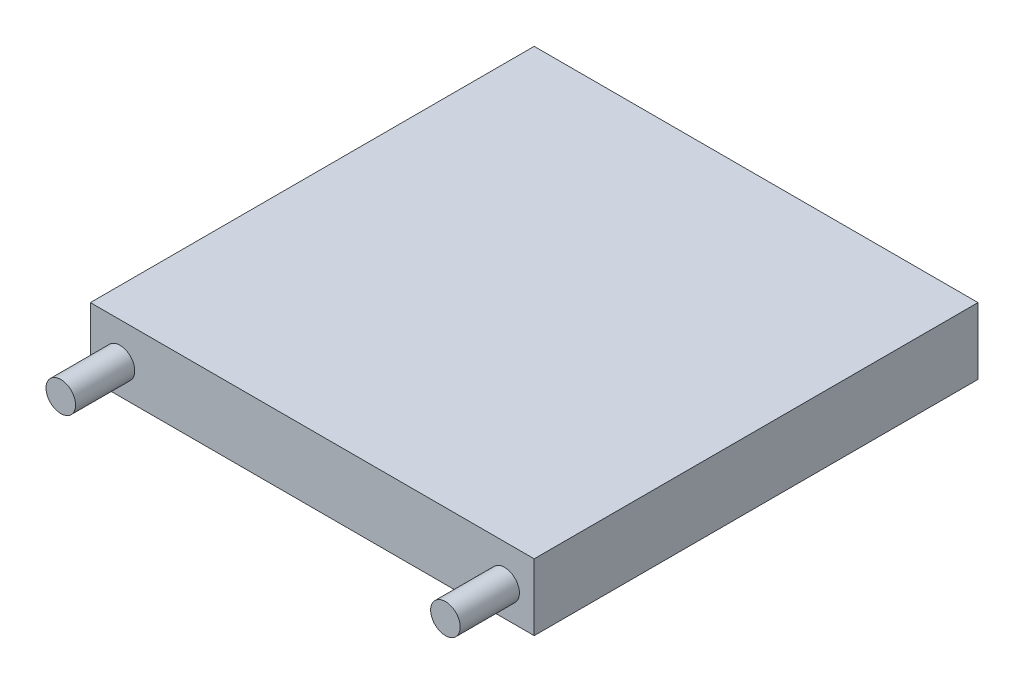
ISO-10303-21;
HEADER;
FILE_DESCRIPTION(('STEP AP214'),'2;1');
FILE_NAME('part.step','',(''),(''),'','','');
FILE_SCHEMA(('AUTOMOTIVE_DESIGN { 1 0 10303 214 1 1 1 1 }'));
ENDSEC;
DATA;
#1=APPLICATION_CONTEXT('core data for automotive mechanical design processes');
#2=APPLICATION_PROTOCOL_DEFINITION('international standard','automotive_design',2000,#1);
#3=PRODUCT_CONTEXT('',#1,'mechanical');
#4=PRODUCT('Part','Part','',(#3));
#5=PRODUCT_RELATED_PRODUCT_CATEGORY('part','',(#4));
#6=PRODUCT_DEFINITION_FORMATION('','',#4);
#7=PRODUCT_DEFINITION_CONTEXT('part definition',#1,'design');
#8=PRODUCT_DEFINITION('design','',#6,#7);
#9=PRODUCT_DEFINITION_SHAPE('','',#8);
#10=(LENGTH_UNIT() NAMED_UNIT(*) SI_UNIT(.MILLI.,.METRE.));
#11=(NAMED_UNIT(*) PLANE_ANGLE_UNIT() SI_UNIT($,.RADIAN.));
#12=(NAMED_UNIT(*) SI_UNIT($,.STERADIAN.) SOLID_ANGLE_UNIT());
#13=UNCERTAINTY_MEASURE_WITH_UNIT(LENGTH_MEASURE(1.E-05),#10,'distance_accuracy_value','');
#14=(GEOMETRIC_REPRESENTATION_CONTEXT(3) GLOBAL_UNCERTAINTY_ASSIGNED_CONTEXT((#13)) GLOBAL_UNIT_ASSIGNED_CONTEXT((#10,
#11,#12)) REPRESENTATION_CONTEXT('',''));
#15=CARTESIAN_POINT('',(0.,0.,0.));
#16=DIRECTION('',(0.,0.,1.));
#17=DIRECTION('',(1.,0.,0.));
#18=AXIS2_PLACEMENT_3D('',#15,#16,#17);
#19=CARTESIAN_POINT('',(15.,4.5,15.));
#20=DIRECTION('',(-1.,0.,0.));
#21=DIRECTION('',(0.,0.,1.));
#22=AXIS2_PLACEMENT_3D('',#19,#20,#21);
#23=PLANE('',#22);
#24=DIRECTION('',(0.,0.,-1.));
#25=VECTOR('',#24,1.);
#26=CARTESIAN_POINT('',(15.,0.,15.));
#27=LINE('',#26,#25);
#28=CARTESIAN_POINT('',(15.,0.,15.));
#29=VERTEX_POINT('',#28);
#30=CARTESIAN_POINT('',(15.,0.,-15.));
#31=VERTEX_POINT('',#30);
#32=EDGE_CURVE('E102',#29,#31,#27,.T.);
#33=ORIENTED_EDGE('',*,*,#32,.T.);
#34=DIRECTION('',(0.,-1.,0.));
#35=VECTOR('',#34,1.);
#36=CARTESIAN_POINT('',(15.,4.5,-15.));
#37=LINE('',#36,#35);
#38=CARTESIAN_POINT('',(15.,4.5,-15.));
#39=VERTEX_POINT('',#38);
#40=EDGE_CURVE('E93',#39,#31,#37,.T.);
#41=ORIENTED_EDGE('',*,*,#40,.F.);
#42=DIRECTION('',(0.,0.,-1.));
#43=VECTOR('',#42,1.);
#44=CARTESIAN_POINT('',(15.,4.5,15.));
#45=LINE('',#44,#43);
#46=CARTESIAN_POINT('',(15.,4.5,15.));
#47=VERTEX_POINT('',#46);
#48=EDGE_CURVE('E87',#47,#39,#45,.T.);
#49=ORIENTED_EDGE('',*,*,#48,.F.);
#50=DIRECTION('',(0.,-1.,0.));
#51=VECTOR('',#50,1.);
#52=CARTESIAN_POINT('',(15.,4.5,15.));
#53=LINE('',#52,#51);
#54=EDGE_CURVE('E98',#47,#29,#53,.T.);
#55=ORIENTED_EDGE('',*,*,#54,.T.);
#56=EDGE_LOOP('',(#33,#41,#49,#55));
#57=FACE_BOUND('',#56,.T.);
#58=ADVANCED_FACE('F35',(#57),#23,.F.);
#59=CARTESIAN_POINT('',(-15.,4.5,-15.));
#60=DIRECTION('',(0.,0.,1.));
#61=DIRECTION('',(1.,0.,0.));
#62=AXIS2_PLACEMENT_3D('',#59,#60,#61);
#63=PLANE('',#62);
#64=DIRECTION('',(-1.,0.,0.));
#65=VECTOR('',#64,1.);
#66=CARTESIAN_POINT('',(-15.,0.,-15.));
#67=LINE('',#66,#65);
#68=CARTESIAN_POINT('',(-15.,0.,-15.));
#69=VERTEX_POINT('',#68);
#70=EDGE_CURVE('E92',#31,#69,#67,.T.);
#71=ORIENTED_EDGE('',*,*,#70,.T.);
#72=DIRECTION('',(0.,-1.,0.));
#73=VECTOR('',#72,1.);
#74=CARTESIAN_POINT('',(-15.,4.5,-15.));
#75=LINE('',#74,#73);
#76=CARTESIAN_POINT('',(-15.,4.5,-15.));
#77=VERTEX_POINT('',#76);
#78=EDGE_CURVE('E90',#77,#69,#75,.T.);
#79=ORIENTED_EDGE('',*,*,#78,.F.);
#80=DIRECTION('',(-1.,0.,0.));
#81=VECTOR('',#80,1.);
#82=CARTESIAN_POINT('',(-15.,4.5,-15.));
#83=LINE('',#82,#81);
#84=EDGE_CURVE('E82',#39,#77,#83,.T.);
#85=ORIENTED_EDGE('',*,*,#84,.F.);
#86=ORIENTED_EDGE('',*,*,#40,.T.);
#87=EDGE_LOOP('',(#71,#79,#85,#86));
#88=FACE_BOUND('',#87,.T.);
#89=ADVANCED_FACE('F91',(#88),#63,.F.);
#90=CARTESIAN_POINT('',(-15.,4.5,15.));
#91=DIRECTION('',(1.,0.,0.));
#92=DIRECTION('',(0.,0.,-1.));
#93=AXIS2_PLACEMENT_3D('',#90,#91,#92);
#94=PLANE('',#93);
#95=DIRECTION('',(0.,0.,1.));
#96=VECTOR('',#95,1.);
#97=CARTESIAN_POINT('',(-15.,0.,15.));
#98=LINE('',#97,#96);
#99=CARTESIAN_POINT('',(-15.,0.,15.));
#100=VERTEX_POINT('',#99);
#101=EDGE_CURVE('E68',#69,#100,#98,.T.);
#102=ORIENTED_EDGE('',*,*,#101,.T.);
#103=DIRECTION('',(0.,-1.,0.));
#104=VECTOR('',#103,1.);
#105=CARTESIAN_POINT('',(-15.,4.5,15.));
#106=LINE('',#105,#104);
#107=CARTESIAN_POINT('',(-15.,4.5,15.));
#108=VERTEX_POINT('',#107);
#109=EDGE_CURVE('E94',#108,#100,#106,.T.);
#110=ORIENTED_EDGE('',*,*,#109,.F.);
#111=DIRECTION('',(0.,0.,1.));
#112=VECTOR('',#111,1.);
#113=CARTESIAN_POINT('',(-15.,4.5,15.));
#114=LINE('',#113,#112);
#115=EDGE_CURVE('E85',#77,#108,#114,.T.);
#116=ORIENTED_EDGE('',*,*,#115,.F.);
#117=ORIENTED_EDGE('',*,*,#78,.T.);
#118=EDGE_LOOP('',(#102,#110,#116,#117));
#119=FACE_BOUND('',#118,.T.);
#120=ADVANCED_FACE('F96',(#119),#94,.F.);
#121=CARTESIAN_POINT('',(-15.,4.5,15.));
#122=DIRECTION('',(0.,0.,-1.));
#123=DIRECTION('',(-1.,0.,0.));
#124=AXIS2_PLACEMENT_3D('',#121,#122,#123);
#125=PLANE('',#124);
#126=CARTESIAN_POINT('',(13.,2.,15.));
#127=DIRECTION('',(0.,0.,-1.));
#128=DIRECTION('',(-1.,0.,0.));
#129=AXIS2_PLACEMENT_3D('',#126,#127,#128);
#130=CIRCLE('',#129,1.);
#131=CARTESIAN_POINT('',(12.,2.,15.));
#132=VERTEX_POINT('',#131);
#133=EDGE_CURVE('E11',#132,#132,#130,.F.);
#134=ORIENTED_EDGE('',*,*,#133,.F.);
#135=EDGE_LOOP('',(#134));
#136=FACE_BOUND('',#135,.T.);
#137=CARTESIAN_POINT('',(-13.,2.,15.));
#138=DIRECTION('',(0.,0.,-1.));
#139=DIRECTION('',(-1.,0.,0.));
#140=AXIS2_PLACEMENT_3D('',#137,#138,#139);
#141=CIRCLE('',#140,1.);
#142=CARTESIAN_POINT('',(-14.,2.,15.));
#143=VERTEX_POINT('',#142);
#144=EDGE_CURVE('E43',#143,#143,#141,.F.);
#145=ORIENTED_EDGE('',*,*,#144,.F.);
#146=EDGE_LOOP('',(#145));
#147=FACE_BOUND('',#146,.T.);
#148=DIRECTION('',(1.,0.,0.));
#149=VECTOR('',#148,1.);
#150=CARTESIAN_POINT('',(-15.,0.,15.));
#151=LINE('',#150,#149);
#152=EDGE_CURVE('E74',#100,#29,#151,.T.);
#153=ORIENTED_EDGE('',*,*,#152,.T.);
#154=ORIENTED_EDGE('',*,*,#54,.F.);
#155=DIRECTION('',(1.,0.,0.));
#156=VECTOR('',#155,1.);
#157=CARTESIAN_POINT('',(-15.,4.5,15.));
#158=LINE('',#157,#156);
#159=EDGE_CURVE('E51',#108,#47,#158,.T.);
#160=ORIENTED_EDGE('',*,*,#159,.F.);
#161=ORIENTED_EDGE('',*,*,#109,.T.);
#162=EDGE_LOOP('',(#153,#154,#160,#161));
#163=FACE_BOUND('',#162,.T.);
#164=ADVANCED_FACE('F116',(#136,#147,#163),#125,.F.);
#165=CARTESIAN_POINT('',(0.,4.5,0.));
#166=DIRECTION('',(0.,-1.,0.));
#167=DIRECTION('',(0.,0.,-1.));
#168=AXIS2_PLACEMENT_3D('',#165,#166,#167);
#169=PLANE('',#168);
#170=ORIENTED_EDGE('',*,*,#48,.T.);
#171=ORIENTED_EDGE('',*,*,#84,.T.);
#172=ORIENTED_EDGE('',*,*,#115,.T.);
#173=ORIENTED_EDGE('',*,*,#159,.T.);
#174=EDGE_LOOP('',(#170,#171,#172,#173));
#175=FACE_BOUND('',#174,.T.);
#176=ADVANCED_FACE('F83',(#175),#169,.F.);
#177=CARTESIAN_POINT('',(0.,0.,0.));
#178=DIRECTION('',(0.,-1.,0.));
#179=DIRECTION('',(0.,0.,-1.));
#180=AXIS2_PLACEMENT_3D('',#177,#178,#179);
#181=PLANE('',#180);
#182=ORIENTED_EDGE('',*,*,#32,.F.);
#183=ORIENTED_EDGE('',*,*,#152,.F.);
#184=ORIENTED_EDGE('',*,*,#101,.F.);
#185=ORIENTED_EDGE('',*,*,#70,.F.);
#186=EDGE_LOOP('',(#182,#183,#184,#185));
#187=FACE_BOUND('',#186,.T.);
#188=ADVANCED_FACE('F124',(#187),#181,.T.);
#189=CARTESIAN_POINT('',(-13.,2.,19.));
#190=DIRECTION('',(0.,0.,-1.));
#191=DIRECTION('',(-1.,0.,0.));
#192=AXIS2_PLACEMENT_3D('',#189,#190,#191);
#193=CYLINDRICAL_SURFACE('',#192,1.);
#194=CARTESIAN_POINT('',(-13.,2.,19.));
#195=DIRECTION('',(0.,0.,1.));
#196=DIRECTION('',(1.,0.,0.));
#197=AXIS2_PLACEMENT_3D('',#194,#195,#196);
#198=CIRCLE('',#197,1.);
#199=CARTESIAN_POINT('',(-12.,2.,19.));
#200=VERTEX_POINT('',#199);
#201=EDGE_CURVE('E105',#200,#200,#198,.T.);
#202=ORIENTED_EDGE('',*,*,#201,.F.);
#203=EDGE_LOOP('',(#202));
#204=FACE_BOUND('',#203,.T.);
#205=ORIENTED_EDGE('',*,*,#144,.T.);
#206=EDGE_LOOP('',(#205));
#207=FACE_BOUND('',#206,.T.);
#208=ADVANCED_FACE('F114',(#204,#207),#193,.T.);
#209=CARTESIAN_POINT('',(-13.,2.,19.));
#210=DIRECTION('',(0.,0.,1.));
#211=DIRECTION('',(1.,0.,0.));
#212=AXIS2_PLACEMENT_3D('',#209,#210,#211);
#213=PLANE('',#212);
#214=ORIENTED_EDGE('',*,*,#201,.T.);
#215=EDGE_LOOP('',(#214));
#216=FACE_BOUND('',#215,.T.);
#217=ADVANCED_FACE('F140',(#216),#213,.T.);
#218=CARTESIAN_POINT('',(13.,2.,19.));
#219=DIRECTION('',(0.,0.,-1.));
#220=DIRECTION('',(-1.,0.,0.));
#221=AXIS2_PLACEMENT_3D('',#218,#219,#220);
#222=CYLINDRICAL_SURFACE('',#221,1.);
#223=CARTESIAN_POINT('',(13.,2.,19.));
#224=DIRECTION('',(0.,0.,1.));
#225=DIRECTION('',(-1.,0.,0.));
#226=AXIS2_PLACEMENT_3D('',#223,#224,#225);
#227=CIRCLE('',#226,1.);
#228=CARTESIAN_POINT('',(12.,2.,19.));
#229=VERTEX_POINT('',#228);
#230=EDGE_CURVE('E158',#229,#229,#227,.T.);
#231=ORIENTED_EDGE('',*,*,#230,.F.);
#232=EDGE_LOOP('',(#231));
#233=FACE_BOUND('',#232,.T.);
#234=ORIENTED_EDGE('',*,*,#133,.T.);
#235=EDGE_LOOP('',(#234));
#236=FACE_BOUND('',#235,.T.);
#237=ADVANCED_FACE('F146',(#233,#236),#222,.T.);
#238=CARTESIAN_POINT('',(13.,2.,19.));
#239=DIRECTION('',(0.,0.,-1.));
#240=DIRECTION('',(-1.,0.,0.));
#241=AXIS2_PLACEMENT_3D('',#238,#239,#240);
#242=PLANE('',#241);
#243=ORIENTED_EDGE('',*,*,#230,.T.);
#244=EDGE_LOOP('',(#243));
#245=FACE_BOUND('',#244,.T.);
#246=ADVANCED_FACE('F150',(#245),#242,.F.);
#247=CLOSED_SHELL('',(#58,#89,#120,#164,#176,#188,#208,#217,#237,#246));
#248=MANIFOLD_SOLID_BREP('B2',#247);
#249=ADVANCED_BREP_SHAPE_REPRESENTATION('',(#18,#248),#14);
#250=SHAPE_DEFINITION_REPRESENTATION(#9,#249);
ENDSEC;
END-ISO-10303-21;
